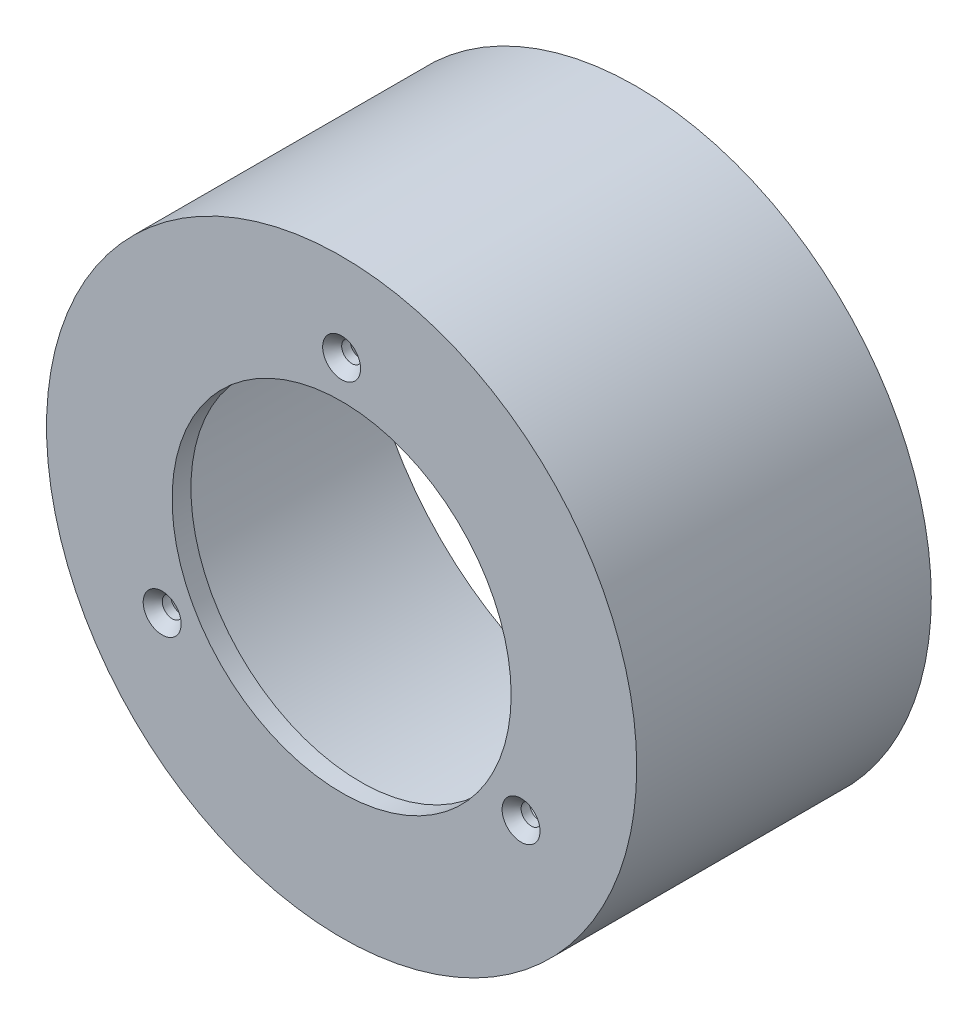
ISO-10303-21;
HEADER;
FILE_DESCRIPTION(('STEP AP214'),'2;1');
FILE_NAME('part.step','',(''),(''),'','','');
FILE_SCHEMA(('AUTOMOTIVE_DESIGN { 1 0 10303 214 1 1 1 1 }'));
ENDSEC;
DATA;
#1=APPLICATION_CONTEXT('core data for automotive mechanical design processes');
#2=APPLICATION_PROTOCOL_DEFINITION('international standard','automotive_design',2000,#1);
#3=PRODUCT_CONTEXT('',#1,'mechanical');
#4=PRODUCT('Part','Part','',(#3));
#5=PRODUCT_RELATED_PRODUCT_CATEGORY('part','',(#4));
#6=PRODUCT_DEFINITION_FORMATION('','',#4);
#7=PRODUCT_DEFINITION_CONTEXT('part definition',#1,'design');
#8=PRODUCT_DEFINITION('design','',#6,#7);
#9=PRODUCT_DEFINITION_SHAPE('','',#8);
#10=(LENGTH_UNIT() NAMED_UNIT(*) SI_UNIT(.MILLI.,.METRE.));
#11=(NAMED_UNIT(*) PLANE_ANGLE_UNIT() SI_UNIT($,.RADIAN.));
#12=(NAMED_UNIT(*) SI_UNIT($,.STERADIAN.) SOLID_ANGLE_UNIT());
#13=UNCERTAINTY_MEASURE_WITH_UNIT(LENGTH_MEASURE(1.E-05),#10,'distance_accuracy_value','');
#14=(GEOMETRIC_REPRESENTATION_CONTEXT(3) GLOBAL_UNCERTAINTY_ASSIGNED_CONTEXT((#13)) GLOBAL_UNIT_ASSIGNED_CONTEXT((#10,
#11,#12)) REPRESENTATION_CONTEXT('',''));
#15=CARTESIAN_POINT('',(0.,0.,0.));
#16=DIRECTION('',(0.,0.,1.));
#17=DIRECTION('',(1.,0.,0.));
#18=AXIS2_PLACEMENT_3D('',#15,#16,#17);
#19=CARTESIAN_POINT('',(0.,0.,1.5));
#20=DIRECTION('',(0.,0.,-1.));
#21=DIRECTION('',(-1.,0.,0.));
#22=AXIS2_PLACEMENT_3D('',#19,#20,#21);
#23=CYLINDRICAL_SURFACE('',#22,13.5);
#24=CARTESIAN_POINT('',(0.,0.,1.5));
#25=DIRECTION('',(0.,0.,1.));
#26=DIRECTION('',(1.,0.,0.));
#27=AXIS2_PLACEMENT_3D('',#24,#25,#26);
#28=CIRCLE('',#27,13.5);
#29=CARTESIAN_POINT('',(13.5,0.,1.5));
#30=VERTEX_POINT('',#29);
#31=EDGE_CURVE('E10',#30,#30,#28,.T.);
#32=ORIENTED_EDGE('',*,*,#31,.T.);
#33=EDGE_LOOP('',(#32));
#34=FACE_BOUND('',#33,.T.);
#35=CARTESIAN_POINT('',(0.,0.,0.));
#36=DIRECTION('',(0.,0.,1.));
#37=DIRECTION('',(1.,0.,0.));
#38=AXIS2_PLACEMENT_3D('',#35,#36,#37);
#39=CIRCLE('',#38,13.5);
#40=CARTESIAN_POINT('',(13.5,0.,0.));
#41=VERTEX_POINT('',#40);
#42=EDGE_CURVE('E41',#41,#41,#39,.T.);
#43=ORIENTED_EDGE('',*,*,#42,.F.);
#44=EDGE_LOOP('',(#43));
#45=FACE_BOUND('',#44,.T.);
#46=ADVANCED_FACE('F34',(#34,#45),#23,.F.);
#47=CARTESIAN_POINT('',(0.,-45.2414213562373,1.5));
#48=DIRECTION('',(0.,0.,1.));
#49=DIRECTION('',(1.,0.,0.));
#50=AXIS2_PLACEMENT_3D('',#47,#48,#49);
#51=PLANE('',#50);
#52=CARTESIAN_POINT('',(0.,16.5,1.5));
#53=DIRECTION('',(0.,0.,1.));
#54=DIRECTION('',(1.,0.,0.));
#55=AXIS2_PLACEMENT_3D('',#52,#53,#54);
#56=CIRCLE('',#55,1.5113);
#57=CARTESIAN_POINT('',(1.5113,16.5,1.5));
#58=VERTEX_POINT('',#57);
#59=EDGE_CURVE('E114',#58,#58,#56,.T.);
#60=ORIENTED_EDGE('',*,*,#59,.F.);
#61=EDGE_LOOP('',(#60));
#62=FACE_BOUND('',#61,.T.);
#63=CARTESIAN_POINT('',(14.2894191624432,-8.25000000000007,1.5));
#64=DIRECTION('',(0.,0.,1.));
#65=DIRECTION('',(1.,0.,0.));
#66=AXIS2_PLACEMENT_3D('',#63,#64,#65);
#67=CIRCLE('',#66,1.5113);
#68=CARTESIAN_POINT('',(15.8007191624432,-8.25000000000007,1.5));
#69=VERTEX_POINT('',#68);
#70=EDGE_CURVE('E64',#69,#69,#67,.T.);
#71=ORIENTED_EDGE('',*,*,#70,.F.);
#72=EDGE_LOOP('',(#71));
#73=FACE_BOUND('',#72,.T.);
#74=CARTESIAN_POINT('',(-14.2894191624433,-8.24999999999986,1.5));
#75=DIRECTION('',(0.,0.,1.));
#76=DIRECTION('',(1.,0.,0.));
#77=AXIS2_PLACEMENT_3D('',#74,#75,#76);
#78=CIRCLE('',#77,1.5113);
#79=CARTESIAN_POINT('',(-12.7781191624433,-8.24999999999986,1.5));
#80=VERTEX_POINT('',#79);
#81=EDGE_CURVE('E57',#80,#80,#78,.T.);
#82=ORIENTED_EDGE('',*,*,#81,.F.);
#83=EDGE_LOOP('',(#82));
#84=FACE_BOUND('',#83,.T.);
#85=ORIENTED_EDGE('',*,*,#31,.F.);
#86=EDGE_LOOP('',(#85));
#87=FACE_BOUND('',#86,.T.);
#88=CARTESIAN_POINT('',(0.,0.,1.5));
#89=DIRECTION('',(0.,0.,1.));
#90=DIRECTION('',(1.,0.,0.));
#91=AXIS2_PLACEMENT_3D('',#88,#89,#90);
#92=CIRCLE('',#91,23.5);
#93=CARTESIAN_POINT('',(23.5,0.,1.5));
#94=VERTEX_POINT('',#93);
#95=EDGE_CURVE('E46',#94,#94,#92,.T.);
#96=ORIENTED_EDGE('',*,*,#95,.T.);
#97=EDGE_LOOP('',(#96));
#98=FACE_BOUND('',#97,.T.);
#99=ADVANCED_FACE('F85',(#62,#73,#84,#87,#98),#51,.T.);
#100=CARTESIAN_POINT('',(0.,-45.2414213562373,0.));
#101=DIRECTION('',(0.,0.,1.));
#102=DIRECTION('',(1.,0.,0.));
#103=AXIS2_PLACEMENT_3D('',#100,#101,#102);
#104=PLANE('',#103);
#105=CARTESIAN_POINT('',(0.,16.5,0.));
#106=DIRECTION('',(0.,0.,1.));
#107=DIRECTION('',(1.,0.,0.));
#108=AXIS2_PLACEMENT_3D('',#105,#106,#107);
#109=CIRCLE('',#108,0.806449999999996);
#110=CARTESIAN_POINT('',(0.806449999999996,16.5,0.));
#111=VERTEX_POINT('',#110);
#112=EDGE_CURVE('E37',#111,#111,#109,.T.);
#113=ORIENTED_EDGE('',*,*,#112,.T.);
#114=EDGE_LOOP('',(#113));
#115=FACE_BOUND('',#114,.T.);
#116=CARTESIAN_POINT('',(14.2894191624432,-8.25000000000007,0.));
#117=DIRECTION('',(0.,0.,1.));
#118=DIRECTION('',(1.,0.,0.));
#119=AXIS2_PLACEMENT_3D('',#116,#117,#118);
#120=CIRCLE('',#119,0.806449999999996);
#121=CARTESIAN_POINT('',(15.0958691624432,-8.25000000000007,0.));
#122=VERTEX_POINT('',#121);
#123=EDGE_CURVE('E55',#122,#122,#120,.T.);
#124=ORIENTED_EDGE('',*,*,#123,.T.);
#125=EDGE_LOOP('',(#124));
#126=FACE_BOUND('',#125,.T.);
#127=CARTESIAN_POINT('',(-14.2894191624433,-8.24999999999986,0.));
#128=DIRECTION('',(0.,0.,1.));
#129=DIRECTION('',(1.,0.,0.));
#130=AXIS2_PLACEMENT_3D('',#127,#128,#129);
#131=CIRCLE('',#130,0.806449999999996);
#132=CARTESIAN_POINT('',(-13.4829691624433,-8.24999999999986,0.));
#133=VERTEX_POINT('',#132);
#134=EDGE_CURVE('E51',#133,#133,#131,.T.);
#135=ORIENTED_EDGE('',*,*,#134,.T.);
#136=EDGE_LOOP('',(#135));
#137=FACE_BOUND('',#136,.T.);
#138=CARTESIAN_POINT('',(0.,0.,0.));
#139=DIRECTION('',(0.,0.,-1.));
#140=DIRECTION('',(-1.,0.,0.));
#141=AXIS2_PLACEMENT_3D('',#138,#139,#140);
#142=CIRCLE('',#141,22.);
#143=CARTESIAN_POINT('',(-22.,0.,0.));
#144=VERTEX_POINT('',#143);
#145=EDGE_CURVE('E53',#144,#144,#142,.T.);
#146=ORIENTED_EDGE('',*,*,#145,.T.);
#147=EDGE_LOOP('',(#146));
#148=FACE_BOUND('',#147,.T.);
#149=ORIENTED_EDGE('',*,*,#42,.T.);
#150=EDGE_LOOP('',(#149));
#151=FACE_BOUND('',#150,.T.);
#152=ADVANCED_FACE('F91',(#115,#126,#137,#148,#151),#104,.F.);
#153=CARTESIAN_POINT('',(0.,0.,-66.4680374315355));
#154=DIRECTION('',(0.,0.,1.));
#155=DIRECTION('',(1.,0.,0.));
#156=AXIS2_PLACEMENT_3D('',#153,#154,#155);
#157=CYLINDRICAL_SURFACE('',#156,23.5);
#158=ORIENTED_EDGE('',*,*,#95,.F.);
#159=EDGE_LOOP('',(#158));
#160=FACE_BOUND('',#159,.T.);
#161=CARTESIAN_POINT('',(0.,0.,-21.9577));
#162=DIRECTION('',(0.,0.,-1.));
#163=DIRECTION('',(-1.,0.,0.));
#164=AXIS2_PLACEMENT_3D('',#161,#162,#163);
#165=CIRCLE('',#164,23.5);
#166=CARTESIAN_POINT('',(-23.5,0.,-21.9577));
#167=VERTEX_POINT('',#166);
#168=EDGE_CURVE('E77',#167,#167,#165,.T.);
#169=ORIENTED_EDGE('',*,*,#168,.F.);
#170=EDGE_LOOP('',(#169));
#171=FACE_BOUND('',#170,.T.);
#172=ADVANCED_FACE('F87',(#160,#171),#157,.T.);
#173=CARTESIAN_POINT('',(0.,0.,-21.9577));
#174=DIRECTION('',(0.,0.,-1.));
#175=DIRECTION('',(-1.,0.,0.));
#176=AXIS2_PLACEMENT_3D('',#173,#174,#175);
#177=PLANE('',#176);
#178=ORIENTED_EDGE('',*,*,#168,.T.);
#179=EDGE_LOOP('',(#178));
#180=FACE_BOUND('',#179,.T.);
#181=CARTESIAN_POINT('',(0.,0.,-21.9577));
#182=DIRECTION('',(0.,0.,-1.));
#183=DIRECTION('',(-1.,0.,0.));
#184=AXIS2_PLACEMENT_3D('',#181,#182,#183);
#185=CIRCLE('',#184,22.);
#186=CARTESIAN_POINT('',(-22.,0.,-21.9577));
#187=VERTEX_POINT('',#186);
#188=EDGE_CURVE('E74',#187,#187,#185,.T.);
#189=ORIENTED_EDGE('',*,*,#188,.F.);
#190=EDGE_LOOP('',(#189));
#191=FACE_BOUND('',#190,.T.);
#192=ADVANCED_FACE('F90',(#180,#191),#177,.T.);
#193=CARTESIAN_POINT('',(0.,0.,-21.9577));
#194=DIRECTION('',(0.,0.,1.));
#195=DIRECTION('',(1.,0.,0.));
#196=AXIS2_PLACEMENT_3D('',#193,#194,#195);
#197=CYLINDRICAL_SURFACE('',#196,22.);
#198=ORIENTED_EDGE('',*,*,#188,.T.);
#199=EDGE_LOOP('',(#198));
#200=FACE_BOUND('',#199,.T.);
#201=ORIENTED_EDGE('',*,*,#145,.F.);
#202=EDGE_LOOP('',(#201));
#203=FACE_BOUND('',#202,.T.);
#204=ADVANCED_FACE('F97',(#200,#203),#197,.F.);
#205=CARTESIAN_POINT('',(-14.2894191624433,-8.24999999999986,1.5));
#206=DIRECTION('',(0.,0.,1.));
#207=DIRECTION('',(1.,0.,0.));
#208=AXIS2_PLACEMENT_3D('',#205,#206,#207);
#209=CYLINDRICAL_SURFACE('',#208,0.806449999999996);
#210=CARTESIAN_POINT('',(-14.2894191624433,-8.24999999999986,0.689162828170267));
#211=DIRECTION('',(0.,0.,1.));
#212=DIRECTION('',(1.,0.,0.));
#213=AXIS2_PLACEMENT_3D('',#210,#211,#212);
#214=CIRCLE('',#213,0.806449999999997);
#215=CARTESIAN_POINT('',(-13.4829691624433,-8.24999999999986,0.689162828170267));
#216=VERTEX_POINT('',#215);
#217=EDGE_CURVE('E54',#216,#216,#214,.T.);
#218=ORIENTED_EDGE('',*,*,#217,.T.);
#219=EDGE_LOOP('',(#218));
#220=FACE_BOUND('',#219,.T.);
#221=ORIENTED_EDGE('',*,*,#134,.F.);
#222=EDGE_LOOP('',(#221));
#223=FACE_BOUND('',#222,.T.);
#224=ADVANCED_FACE('F123',(#220,#223),#209,.F.);
#225=CARTESIAN_POINT('',(-14.2894191624433,-8.24999999999986,1.5));
#226=DIRECTION('',(0.,0.,1.));
#227=DIRECTION('',(1.,0.,0.));
#228=AXIS2_PLACEMENT_3D('',#225,#226,#227);
#229=CONICAL_SURFACE('',#228,1.5113,0.715584993317674);
#230=ORIENTED_EDGE('',*,*,#217,.F.);
#231=EDGE_LOOP('',(#230));
#232=FACE_BOUND('',#231,.T.);
#233=ORIENTED_EDGE('',*,*,#81,.T.);
#234=EDGE_LOOP('',(#233));
#235=FACE_BOUND('',#234,.T.);
#236=ADVANCED_FACE('F120',(#232,#235),#229,.F.);
#237=CARTESIAN_POINT('',(14.2894191624432,-8.25000000000007,1.5));
#238=DIRECTION('',(0.,0.,1.));
#239=DIRECTION('',(1.,0.,0.));
#240=AXIS2_PLACEMENT_3D('',#237,#238,#239);
#241=CYLINDRICAL_SURFACE('',#240,0.806449999999996);
#242=CARTESIAN_POINT('',(14.2894191624432,-8.25000000000007,0.689162828170267));
#243=DIRECTION('',(0.,0.,1.));
#244=DIRECTION('',(1.,0.,0.));
#245=AXIS2_PLACEMENT_3D('',#242,#243,#244);
#246=CIRCLE('',#245,0.806449999999997);
#247=CARTESIAN_POINT('',(15.0958691624432,-8.25000000000007,0.689162828170267));
#248=VERTEX_POINT('',#247);
#249=EDGE_CURVE('E58',#248,#248,#246,.T.);
#250=ORIENTED_EDGE('',*,*,#249,.T.);
#251=EDGE_LOOP('',(#250));
#252=FACE_BOUND('',#251,.T.);
#253=ORIENTED_EDGE('',*,*,#123,.F.);
#254=EDGE_LOOP('',(#253));
#255=FACE_BOUND('',#254,.T.);
#256=ADVANCED_FACE('F122',(#252,#255),#241,.F.);
#257=CARTESIAN_POINT('',(14.2894191624432,-8.25000000000007,1.5));
#258=DIRECTION('',(0.,0.,1.));
#259=DIRECTION('',(1.,0.,0.));
#260=AXIS2_PLACEMENT_3D('',#257,#258,#259);
#261=CONICAL_SURFACE('',#260,1.5113,0.715584993317674);
#262=ORIENTED_EDGE('',*,*,#249,.F.);
#263=EDGE_LOOP('',(#262));
#264=FACE_BOUND('',#263,.T.);
#265=ORIENTED_EDGE('',*,*,#70,.T.);
#266=EDGE_LOOP('',(#265));
#267=FACE_BOUND('',#266,.T.);
#268=ADVANCED_FACE('F130',(#264,#267),#261,.F.);
#269=CARTESIAN_POINT('',(0.,16.5,1.5));
#270=DIRECTION('',(0.,0.,1.));
#271=DIRECTION('',(1.,0.,0.));
#272=AXIS2_PLACEMENT_3D('',#269,#270,#271);
#273=CYLINDRICAL_SURFACE('',#272,0.806449999999996);
#274=CARTESIAN_POINT('',(0.,16.5,0.689162828170267));
#275=DIRECTION('',(0.,0.,1.));
#276=DIRECTION('',(1.,0.,0.));
#277=AXIS2_PLACEMENT_3D('',#274,#275,#276);
#278=CIRCLE('',#277,0.806449999999997);
#279=CARTESIAN_POINT('',(0.806449999999997,16.5,0.689162828170267));
#280=VERTEX_POINT('',#279);
#281=EDGE_CURVE('E200',#280,#280,#278,.T.);
#282=ORIENTED_EDGE('',*,*,#281,.T.);
#283=EDGE_LOOP('',(#282));
#284=FACE_BOUND('',#283,.T.);
#285=ORIENTED_EDGE('',*,*,#112,.F.);
#286=EDGE_LOOP('',(#285));
#287=FACE_BOUND('',#286,.T.);
#288=ADVANCED_FACE('F174',(#284,#287),#273,.F.);
#289=CARTESIAN_POINT('',(0.,16.5,1.5));
#290=DIRECTION('',(0.,0.,1.));
#291=DIRECTION('',(1.,0.,0.));
#292=AXIS2_PLACEMENT_3D('',#289,#290,#291);
#293=CONICAL_SURFACE('',#292,1.5113,0.715584993317674);
#294=ORIENTED_EDGE('',*,*,#281,.F.);
#295=EDGE_LOOP('',(#294));
#296=FACE_BOUND('',#295,.T.);
#297=ORIENTED_EDGE('',*,*,#59,.T.);
#298=EDGE_LOOP('',(#297));
#299=FACE_BOUND('',#298,.T.);
#300=ADVANCED_FACE('F183',(#296,#299),#293,.F.);
#301=CLOSED_SHELL('',(#46,#99,#152,#172,#192,#204,#224,#236,#256,#268,#288,#300));
#302=MANIFOLD_SOLID_BREP('B2',#301);
#303=ADVANCED_BREP_SHAPE_REPRESENTATION('',(#18,#302),#14);
#304=SHAPE_DEFINITION_REPRESENTATION(#9,#303);
ENDSEC;
END-ISO-10303-21;
